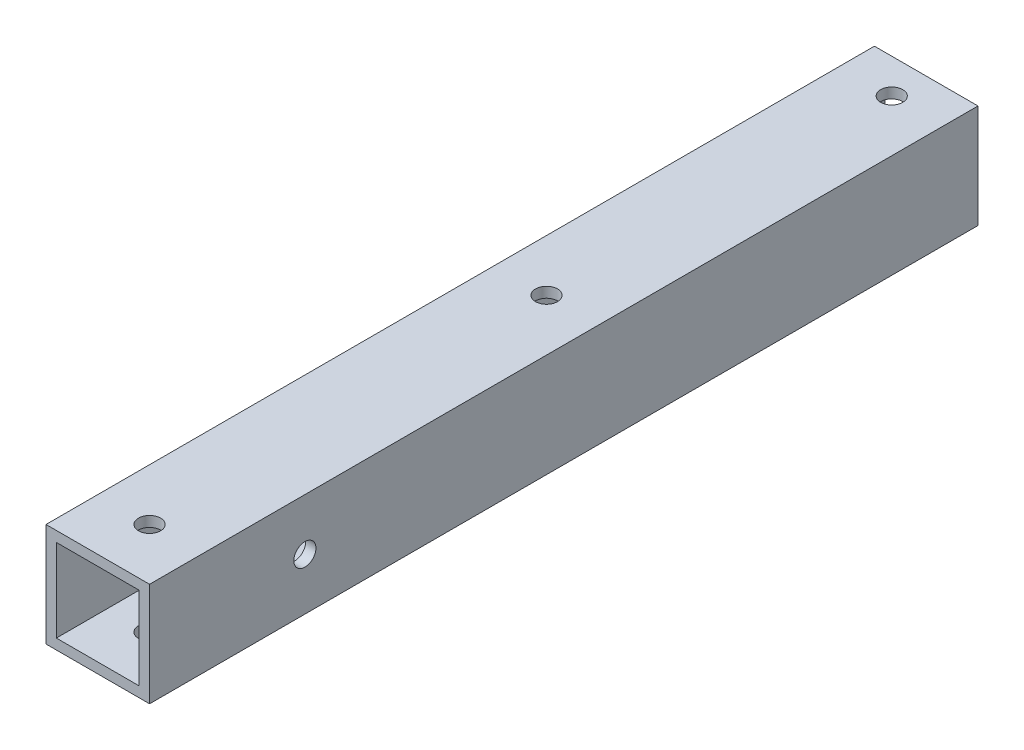
ISO-10303-21;
HEADER;
FILE_DESCRIPTION(('STEP AP214'),'2;1');
FILE_NAME('part.step','',(''),(''),'','','');
FILE_SCHEMA(('AUTOMOTIVE_DESIGN { 1 0 10303 214 1 1 1 1 }'));
ENDSEC;
DATA;
#1=APPLICATION_CONTEXT('core data for automotive mechanical design processes');
#2=APPLICATION_PROTOCOL_DEFINITION('international standard','automotive_design',2000,#1);
#3=PRODUCT_CONTEXT('',#1,'mechanical');
#4=PRODUCT('Part','Part','',(#3));
#5=PRODUCT_RELATED_PRODUCT_CATEGORY('part','',(#4));
#6=PRODUCT_DEFINITION_FORMATION('','',#4);
#7=PRODUCT_DEFINITION_CONTEXT('part definition',#1,'design');
#8=PRODUCT_DEFINITION('design','',#6,#7);
#9=PRODUCT_DEFINITION_SHAPE('','',#8);
#10=(LENGTH_UNIT() NAMED_UNIT(*) SI_UNIT(.MILLI.,.METRE.));
#11=(NAMED_UNIT(*) PLANE_ANGLE_UNIT() SI_UNIT($,.RADIAN.));
#12=(NAMED_UNIT(*) SI_UNIT($,.STERADIAN.) SOLID_ANGLE_UNIT());
#13=UNCERTAINTY_MEASURE_WITH_UNIT(LENGTH_MEASURE(1.E-05),#10,'distance_accuracy_value','');
#14=(GEOMETRIC_REPRESENTATION_CONTEXT(3) GLOBAL_UNCERTAINTY_ASSIGNED_CONTEXT((#13)) GLOBAL_UNIT_ASSIGNED_CONTEXT((#10,
#11,#12)) REPRESENTATION_CONTEXT('',''));
#15=CARTESIAN_POINT('',(0.,0.,0.));
#16=DIRECTION('',(0.,0.,1.));
#17=DIRECTION('',(1.,0.,0.));
#18=AXIS2_PLACEMENT_3D('',#15,#16,#17);
#19=CARTESIAN_POINT('',(0.,0.,120.));
#20=DIRECTION('',(0.,0.,1.));
#21=DIRECTION('',(1.,0.,0.));
#22=AXIS2_PLACEMENT_3D('',#19,#20,#21);
#23=PLANE('',#22);
#24=DIRECTION('',(0.,1.,0.));
#25=VECTOR('',#24,1.);
#26=CARTESIAN_POINT('',(7.5,7.5,120.));
#27=LINE('',#26,#25);
#28=CARTESIAN_POINT('',(7.5,-7.5,120.));
#29=VERTEX_POINT('',#28);
#30=CARTESIAN_POINT('',(7.5,7.5,120.));
#31=VERTEX_POINT('',#30);
#32=EDGE_CURVE('E157',#29,#31,#27,.T.);
#33=ORIENTED_EDGE('',*,*,#32,.T.);
#34=DIRECTION('',(-1.,0.,0.));
#35=VECTOR('',#34,1.);
#36=CARTESIAN_POINT('',(-7.5,7.5,120.));
#37=LINE('',#36,#35);
#38=CARTESIAN_POINT('',(-7.5,7.5,120.));
#39=VERTEX_POINT('',#38);
#40=EDGE_CURVE('E161',#31,#39,#37,.T.);
#41=ORIENTED_EDGE('',*,*,#40,.T.);
#42=DIRECTION('',(0.,-1.,0.));
#43=VECTOR('',#42,1.);
#44=CARTESIAN_POINT('',(-7.5,7.5,120.));
#45=LINE('',#44,#43);
#46=CARTESIAN_POINT('',(-7.5,-7.5,120.));
#47=VERTEX_POINT('',#46);
#48=EDGE_CURVE('E165',#39,#47,#45,.T.);
#49=ORIENTED_EDGE('',*,*,#48,.T.);
#50=DIRECTION('',(1.,0.,0.));
#51=VECTOR('',#50,1.);
#52=CARTESIAN_POINT('',(-7.5,-7.5,120.));
#53=LINE('',#52,#51);
#54=EDGE_CURVE('E168',#47,#29,#53,.T.);
#55=ORIENTED_EDGE('',*,*,#54,.T.);
#56=EDGE_LOOP('',(#33,#41,#49,#55));
#57=FACE_BOUND('',#56,.T.);
#58=DIRECTION('',(1.,0.,0.));
#59=VECTOR('',#58,1.);
#60=CARTESIAN_POINT('',(-6.,-6.,120.));
#61=LINE('',#60,#59);
#62=CARTESIAN_POINT('',(-6.,-6.,120.));
#63=VERTEX_POINT('',#62);
#64=CARTESIAN_POINT('',(6.,-6.,120.));
#65=VERTEX_POINT('',#64);
#66=EDGE_CURVE('E116',#63,#65,#61,.T.);
#67=ORIENTED_EDGE('',*,*,#66,.F.);
#68=DIRECTION('',(0.,-1.,0.));
#69=VECTOR('',#68,1.);
#70=CARTESIAN_POINT('',(-6.,6.,120.));
#71=LINE('',#70,#69);
#72=CARTESIAN_POINT('',(-6.,6.,120.));
#73=VERTEX_POINT('',#72);
#74=EDGE_CURVE('E107',#73,#63,#71,.T.);
#75=ORIENTED_EDGE('',*,*,#74,.F.);
#76=DIRECTION('',(-1.,0.,0.));
#77=VECTOR('',#76,1.);
#78=CARTESIAN_POINT('',(-6.,6.,120.));
#79=LINE('',#78,#77);
#80=CARTESIAN_POINT('',(6.,6.,120.));
#81=VERTEX_POINT('',#80);
#82=EDGE_CURVE('E133',#81,#73,#79,.T.);
#83=ORIENTED_EDGE('',*,*,#82,.F.);
#84=DIRECTION('',(0.,1.,0.));
#85=VECTOR('',#84,1.);
#86=CARTESIAN_POINT('',(6.,6.,120.));
#87=LINE('',#86,#85);
#88=EDGE_CURVE('E129',#65,#81,#87,.T.);
#89=ORIENTED_EDGE('',*,*,#88,.F.);
#90=EDGE_LOOP('',(#67,#75,#83,#89));
#91=FACE_BOUND('',#90,.T.);
#92=ADVANCED_FACE('F39',(#57,#91),#23,.T.);
#93=CARTESIAN_POINT('',(0.,0.,0.));
#94=DIRECTION('',(0.,0.,1.));
#95=DIRECTION('',(1.,0.,0.));
#96=AXIS2_PLACEMENT_3D('',#93,#94,#95);
#97=PLANE('',#96);
#98=DIRECTION('',(0.,1.,0.));
#99=VECTOR('',#98,1.);
#100=CARTESIAN_POINT('',(7.5,7.5,0.));
#101=LINE('',#100,#99);
#102=CARTESIAN_POINT('',(7.5,-7.5,0.));
#103=VERTEX_POINT('',#102);
#104=CARTESIAN_POINT('',(7.5,7.5,0.));
#105=VERTEX_POINT('',#104);
#106=EDGE_CURVE('E125',#103,#105,#101,.T.);
#107=ORIENTED_EDGE('',*,*,#106,.F.);
#108=DIRECTION('',(1.,0.,0.));
#109=VECTOR('',#108,1.);
#110=CARTESIAN_POINT('',(-7.5,-7.5,0.));
#111=LINE('',#110,#109);
#112=CARTESIAN_POINT('',(-7.5,-7.5,0.));
#113=VERTEX_POINT('',#112);
#114=EDGE_CURVE('E162',#113,#103,#111,.T.);
#115=ORIENTED_EDGE('',*,*,#114,.F.);
#116=DIRECTION('',(0.,-1.,0.));
#117=VECTOR('',#116,1.);
#118=CARTESIAN_POINT('',(-7.5,7.5,0.));
#119=LINE('',#118,#117);
#120=CARTESIAN_POINT('',(-7.5,7.5,0.));
#121=VERTEX_POINT('',#120);
#122=EDGE_CURVE('E178',#121,#113,#119,.T.);
#123=ORIENTED_EDGE('',*,*,#122,.F.);
#124=DIRECTION('',(-1.,0.,0.));
#125=VECTOR('',#124,1.);
#126=CARTESIAN_POINT('',(-7.5,7.5,0.));
#127=LINE('',#126,#125);
#128=EDGE_CURVE('E175',#105,#121,#127,.T.);
#129=ORIENTED_EDGE('',*,*,#128,.F.);
#130=EDGE_LOOP('',(#107,#115,#123,#129));
#131=FACE_BOUND('',#130,.T.);
#132=DIRECTION('',(0.,-1.,0.));
#133=VECTOR('',#132,1.);
#134=CARTESIAN_POINT('',(-6.,6.,0.));
#135=LINE('',#134,#133);
#136=CARTESIAN_POINT('',(-6.,6.,0.));
#137=VERTEX_POINT('',#136);
#138=CARTESIAN_POINT('',(-6.,-6.,0.));
#139=VERTEX_POINT('',#138);
#140=EDGE_CURVE('E65',#137,#139,#135,.T.);
#141=ORIENTED_EDGE('',*,*,#140,.T.);
#142=DIRECTION('',(1.,0.,0.));
#143=VECTOR('',#142,1.);
#144=CARTESIAN_POINT('',(-6.,-6.,0.));
#145=LINE('',#144,#143);
#146=CARTESIAN_POINT('',(6.,-6.,0.));
#147=VERTEX_POINT('',#146);
#148=EDGE_CURVE('E123',#139,#147,#145,.T.);
#149=ORIENTED_EDGE('',*,*,#148,.T.);
#150=DIRECTION('',(0.,1.,0.));
#151=VECTOR('',#150,1.);
#152=CARTESIAN_POINT('',(6.,6.,0.));
#153=LINE('',#152,#151);
#154=CARTESIAN_POINT('',(6.,6.,0.));
#155=VERTEX_POINT('',#154);
#156=EDGE_CURVE('E144',#147,#155,#153,.T.);
#157=ORIENTED_EDGE('',*,*,#156,.T.);
#158=DIRECTION('',(-1.,0.,0.));
#159=VECTOR('',#158,1.);
#160=CARTESIAN_POINT('',(-6.,6.,0.));
#161=LINE('',#160,#159);
#162=EDGE_CURVE('E117',#155,#137,#161,.T.);
#163=ORIENTED_EDGE('',*,*,#162,.T.);
#164=EDGE_LOOP('',(#141,#149,#157,#163));
#165=FACE_BOUND('',#164,.T.);
#166=ADVANCED_FACE('F269',(#131,#165),#97,.F.);
#167=CARTESIAN_POINT('',(7.5,7.5,120.));
#168=DIRECTION('',(-1.,0.,0.));
#169=DIRECTION('',(0.,0.,1.));
#170=AXIS2_PLACEMENT_3D('',#167,#168,#169);
#171=PLANE('',#170);
#172=CARTESIAN_POINT('',(7.5,0.,97.5));
#173=DIRECTION('',(1.,0.,0.));
#174=DIRECTION('',(0.,0.,-1.));
#175=AXIS2_PLACEMENT_3D('',#172,#173,#174);
#176=CIRCLE('',#175,1.60000000000001);
#177=CARTESIAN_POINT('',(7.5,0.,95.9));
#178=VERTEX_POINT('',#177);
#179=EDGE_CURVE('E246',#178,#178,#176,.T.);
#180=ORIENTED_EDGE('',*,*,#179,.F.);
#181=EDGE_LOOP('',(#180));
#182=FACE_BOUND('',#181,.T.);
#183=ORIENTED_EDGE('',*,*,#106,.T.);
#184=DIRECTION('',(0.,0.,-1.));
#185=VECTOR('',#184,1.);
#186=CARTESIAN_POINT('',(7.5,7.5,120.));
#187=LINE('',#186,#185);
#188=EDGE_CURVE('E11',#31,#105,#187,.T.);
#189=ORIENTED_EDGE('',*,*,#188,.F.);
#190=ORIENTED_EDGE('',*,*,#32,.F.);
#191=DIRECTION('',(0.,0.,-1.));
#192=VECTOR('',#191,1.);
#193=CARTESIAN_POINT('',(7.5,-7.5,120.));
#194=LINE('',#193,#192);
#195=EDGE_CURVE('E171',#29,#103,#194,.T.);
#196=ORIENTED_EDGE('',*,*,#195,.T.);
#197=EDGE_LOOP('',(#183,#189,#190,#196));
#198=FACE_BOUND('',#197,.T.);
#199=ADVANCED_FACE('F41',(#182,#198),#171,.F.);
#200=CARTESIAN_POINT('',(-7.5,7.5,120.));
#201=DIRECTION('',(0.,-1.,0.));
#202=DIRECTION('',(0.,0.,-1.));
#203=AXIS2_PLACEMENT_3D('',#200,#201,#202);
#204=PLANE('',#203);
#205=CARTESIAN_POINT('',(0.,7.5,5.));
#206=DIRECTION('',(0.,1.,0.));
#207=DIRECTION('',(0.,0.,1.));
#208=AXIS2_PLACEMENT_3D('',#205,#206,#207);
#209=CIRCLE('',#208,1.6);
#210=CARTESIAN_POINT('',(0.,7.5,6.6));
#211=VERTEX_POINT('',#210);
#212=EDGE_CURVE('E236',#211,#211,#209,.T.);
#213=ORIENTED_EDGE('',*,*,#212,.F.);
#214=EDGE_LOOP('',(#213));
#215=FACE_BOUND('',#214,.T.);
#216=CARTESIAN_POINT('',(0.,7.5,112.5));
#217=DIRECTION('',(0.,1.,0.));
#218=DIRECTION('',(0.,0.,1.));
#219=AXIS2_PLACEMENT_3D('',#216,#217,#218);
#220=CIRCLE('',#219,1.6);
#221=CARTESIAN_POINT('',(0.,7.5,114.1));
#222=VERTEX_POINT('',#221);
#223=EDGE_CURVE('E228',#222,#222,#220,.T.);
#224=ORIENTED_EDGE('',*,*,#223,.F.);
#225=EDGE_LOOP('',(#224));
#226=FACE_BOUND('',#225,.T.);
#227=CARTESIAN_POINT('',(0.,7.5,55.));
#228=DIRECTION('',(0.,1.,0.));
#229=DIRECTION('',(0.,0.,1.));
#230=AXIS2_PLACEMENT_3D('',#227,#228,#229);
#231=CIRCLE('',#230,1.6);
#232=CARTESIAN_POINT('',(0.,7.5,56.6));
#233=VERTEX_POINT('',#232);
#234=EDGE_CURVE('E219',#233,#233,#231,.T.);
#235=ORIENTED_EDGE('',*,*,#234,.F.);
#236=EDGE_LOOP('',(#235));
#237=FACE_BOUND('',#236,.T.);
#238=ORIENTED_EDGE('',*,*,#128,.T.);
#239=DIRECTION('',(0.,0.,-1.));
#240=VECTOR('',#239,1.);
#241=CARTESIAN_POINT('',(-7.5,7.5,120.));
#242=LINE('',#241,#240);
#243=EDGE_CURVE('E49',#39,#121,#242,.T.);
#244=ORIENTED_EDGE('',*,*,#243,.F.);
#245=ORIENTED_EDGE('',*,*,#40,.F.);
#246=ORIENTED_EDGE('',*,*,#188,.T.);
#247=EDGE_LOOP('',(#238,#244,#245,#246));
#248=FACE_BOUND('',#247,.T.);
#249=ADVANCED_FACE('F299',(#215,#226,#237,#248),#204,.F.);
#250=CARTESIAN_POINT('',(-7.5,7.5,120.));
#251=DIRECTION('',(1.,0.,0.));
#252=DIRECTION('',(0.,0.,-1.));
#253=AXIS2_PLACEMENT_3D('',#250,#251,#252);
#254=PLANE('',#253);
#255=CARTESIAN_POINT('',(-7.5,0.,97.5));
#256=DIRECTION('',(1.,0.,0.));
#257=DIRECTION('',(0.,0.,-1.));
#258=AXIS2_PLACEMENT_3D('',#255,#256,#257);
#259=CIRCLE('',#258,1.60000000000001);
#260=CARTESIAN_POINT('',(-7.5,0.,95.9));
#261=VERTEX_POINT('',#260);
#262=EDGE_CURVE('E250',#261,#261,#259,.T.);
#263=ORIENTED_EDGE('',*,*,#262,.T.);
#264=EDGE_LOOP('',(#263));
#265=FACE_BOUND('',#264,.T.);
#266=ORIENTED_EDGE('',*,*,#122,.T.);
#267=DIRECTION('',(0.,0.,-1.));
#268=VECTOR('',#267,1.);
#269=CARTESIAN_POINT('',(-7.5,-7.5,120.));
#270=LINE('',#269,#268);
#271=EDGE_CURVE('E186',#47,#113,#270,.T.);
#272=ORIENTED_EDGE('',*,*,#271,.F.);
#273=ORIENTED_EDGE('',*,*,#48,.F.);
#274=ORIENTED_EDGE('',*,*,#243,.T.);
#275=EDGE_LOOP('',(#266,#272,#273,#274));
#276=FACE_BOUND('',#275,.T.);
#277=ADVANCED_FACE('F296',(#265,#276),#254,.F.);
#278=CARTESIAN_POINT('',(-7.5,-7.5,120.));
#279=DIRECTION('',(0.,1.,0.));
#280=DIRECTION('',(0.,0.,1.));
#281=AXIS2_PLACEMENT_3D('',#278,#279,#280);
#282=PLANE('',#281);
#283=CARTESIAN_POINT('',(0.,-7.5,5.));
#284=DIRECTION('',(0.,1.,0.));
#285=DIRECTION('',(0.,0.,1.));
#286=AXIS2_PLACEMENT_3D('',#283,#284,#285);
#287=CIRCLE('',#286,1.6);
#288=CARTESIAN_POINT('',(0.,-7.5,6.6));
#289=VERTEX_POINT('',#288);
#290=EDGE_CURVE('E198',#289,#289,#287,.T.);
#291=ORIENTED_EDGE('',*,*,#290,.T.);
#292=EDGE_LOOP('',(#291));
#293=FACE_BOUND('',#292,.T.);
#294=CARTESIAN_POINT('',(0.,-7.5,112.5));
#295=DIRECTION('',(0.,1.,0.));
#296=DIRECTION('',(0.,0.,1.));
#297=AXIS2_PLACEMENT_3D('',#294,#295,#296);
#298=CIRCLE('',#297,1.6);
#299=CARTESIAN_POINT('',(0.,-7.5,114.1));
#300=VERTEX_POINT('',#299);
#301=EDGE_CURVE('E232',#300,#300,#298,.T.);
#302=ORIENTED_EDGE('',*,*,#301,.T.);
#303=EDGE_LOOP('',(#302));
#304=FACE_BOUND('',#303,.T.);
#305=CARTESIAN_POINT('',(0.,-7.5,55.));
#306=DIRECTION('',(0.,1.,0.));
#307=DIRECTION('',(0.,0.,1.));
#308=AXIS2_PLACEMENT_3D('',#305,#306,#307);
#309=CIRCLE('',#308,1.6);
#310=CARTESIAN_POINT('',(0.,-7.5,56.6));
#311=VERTEX_POINT('',#310);
#312=EDGE_CURVE('E223',#311,#311,#309,.T.);
#313=ORIENTED_EDGE('',*,*,#312,.T.);
#314=EDGE_LOOP('',(#313));
#315=FACE_BOUND('',#314,.T.);
#316=ORIENTED_EDGE('',*,*,#114,.T.);
#317=ORIENTED_EDGE('',*,*,#195,.F.);
#318=ORIENTED_EDGE('',*,*,#54,.F.);
#319=ORIENTED_EDGE('',*,*,#271,.T.);
#320=EDGE_LOOP('',(#316,#317,#318,#319));
#321=FACE_BOUND('',#320,.T.);
#322=ADVANCED_FACE('F293',(#293,#304,#315,#321),#282,.F.);
#323=CARTESIAN_POINT('',(-6.,6.,120.));
#324=DIRECTION('',(1.,0.,0.));
#325=DIRECTION('',(0.,0.,-1.));
#326=AXIS2_PLACEMENT_3D('',#323,#324,#325);
#327=PLANE('',#326);
#328=CARTESIAN_POINT('',(-6.,0.,97.5));
#329=DIRECTION('',(1.,0.,0.));
#330=DIRECTION('',(0.,0.,-1.));
#331=AXIS2_PLACEMENT_3D('',#328,#329,#330);
#332=CIRCLE('',#331,1.60000000000001);
#333=CARTESIAN_POINT('',(-6.,0.,95.9));
#334=VERTEX_POINT('',#333);
#335=EDGE_CURVE('E224',#334,#334,#332,.T.);
#336=ORIENTED_EDGE('',*,*,#335,.F.);
#337=EDGE_LOOP('',(#336));
#338=FACE_BOUND('',#337,.T.);
#339=ORIENTED_EDGE('',*,*,#140,.F.);
#340=DIRECTION('',(0.,0.,-1.));
#341=VECTOR('',#340,1.);
#342=CARTESIAN_POINT('',(-6.,6.,120.));
#343=LINE('',#342,#341);
#344=EDGE_CURVE('E111',#73,#137,#343,.T.);
#345=ORIENTED_EDGE('',*,*,#344,.F.);
#346=ORIENTED_EDGE('',*,*,#74,.T.);
#347=DIRECTION('',(0.,0.,-1.));
#348=VECTOR('',#347,1.);
#349=CARTESIAN_POINT('',(-6.,-6.,120.));
#350=LINE('',#349,#348);
#351=EDGE_CURVE('E110',#63,#139,#350,.T.);
#352=ORIENTED_EDGE('',*,*,#351,.T.);
#353=EDGE_LOOP('',(#339,#345,#346,#352));
#354=FACE_BOUND('',#353,.T.);
#355=ADVANCED_FACE('F109',(#338,#354),#327,.T.);
#356=CARTESIAN_POINT('',(-6.,-6.,120.));
#357=DIRECTION('',(0.,1.,0.));
#358=DIRECTION('',(0.,0.,1.));
#359=AXIS2_PLACEMENT_3D('',#356,#357,#358);
#360=PLANE('',#359);
#361=CARTESIAN_POINT('',(0.,-6.,5.));
#362=DIRECTION('',(0.,1.,0.));
#363=DIRECTION('',(0.,0.,1.));
#364=AXIS2_PLACEMENT_3D('',#361,#362,#363);
#365=CIRCLE('',#364,1.6);
#366=CARTESIAN_POINT('',(0.,-6.,6.6));
#367=VERTEX_POINT('',#366);
#368=EDGE_CURVE('E141',#367,#367,#365,.T.);
#369=ORIENTED_EDGE('',*,*,#368,.F.);
#370=EDGE_LOOP('',(#369));
#371=FACE_BOUND('',#370,.T.);
#372=CARTESIAN_POINT('',(0.,-6.,112.5));
#373=DIRECTION('',(0.,1.,0.));
#374=DIRECTION('',(0.,0.,1.));
#375=AXIS2_PLACEMENT_3D('',#372,#373,#374);
#376=CIRCLE('',#375,1.6);
#377=CARTESIAN_POINT('',(0.,-6.,114.1));
#378=VERTEX_POINT('',#377);
#379=EDGE_CURVE('E202',#378,#378,#376,.T.);
#380=ORIENTED_EDGE('',*,*,#379,.F.);
#381=EDGE_LOOP('',(#380));
#382=FACE_BOUND('',#381,.T.);
#383=CARTESIAN_POINT('',(0.,-6.,55.));
#384=DIRECTION('',(0.,1.,0.));
#385=DIRECTION('',(0.,0.,1.));
#386=AXIS2_PLACEMENT_3D('',#383,#384,#385);
#387=CIRCLE('',#386,1.6);
#388=CARTESIAN_POINT('',(0.,-6.,56.6));
#389=VERTEX_POINT('',#388);
#390=EDGE_CURVE('E197',#389,#389,#387,.T.);
#391=ORIENTED_EDGE('',*,*,#390,.F.);
#392=EDGE_LOOP('',(#391));
#393=FACE_BOUND('',#392,.T.);
#394=ORIENTED_EDGE('',*,*,#148,.F.);
#395=ORIENTED_EDGE('',*,*,#351,.F.);
#396=ORIENTED_EDGE('',*,*,#66,.T.);
#397=DIRECTION('',(0.,0.,-1.));
#398=VECTOR('',#397,1.);
#399=CARTESIAN_POINT('',(6.,-6.,120.));
#400=LINE('',#399,#398);
#401=EDGE_CURVE('E126',#65,#147,#400,.T.);
#402=ORIENTED_EDGE('',*,*,#401,.T.);
#403=EDGE_LOOP('',(#394,#395,#396,#402));
#404=FACE_BOUND('',#403,.T.);
#405=ADVANCED_FACE('F120',(#371,#382,#393,#404),#360,.T.);
#406=CARTESIAN_POINT('',(6.,6.,120.));
#407=DIRECTION('',(-1.,0.,0.));
#408=DIRECTION('',(0.,0.,1.));
#409=AXIS2_PLACEMENT_3D('',#406,#407,#408);
#410=PLANE('',#409);
#411=CARTESIAN_POINT('',(6.,0.,97.5));
#412=DIRECTION('',(-1.,0.,0.));
#413=DIRECTION('',(0.,0.,1.));
#414=AXIS2_PLACEMENT_3D('',#411,#412,#413);
#415=CIRCLE('',#414,1.60000000000001);
#416=CARTESIAN_POINT('',(6.,0.,99.1));
#417=VERTEX_POINT('',#416);
#418=EDGE_CURVE('E43',#417,#417,#415,.T.);
#419=ORIENTED_EDGE('',*,*,#418,.F.);
#420=EDGE_LOOP('',(#419));
#421=FACE_BOUND('',#420,.T.);
#422=ORIENTED_EDGE('',*,*,#156,.F.);
#423=ORIENTED_EDGE('',*,*,#401,.F.);
#424=ORIENTED_EDGE('',*,*,#88,.T.);
#425=DIRECTION('',(0.,0.,-1.));
#426=VECTOR('',#425,1.);
#427=CARTESIAN_POINT('',(6.,6.,120.));
#428=LINE('',#427,#426);
#429=EDGE_CURVE('E57',#81,#155,#428,.T.);
#430=ORIENTED_EDGE('',*,*,#429,.T.);
#431=EDGE_LOOP('',(#422,#423,#424,#430));
#432=FACE_BOUND('',#431,.T.);
#433=ADVANCED_FACE('F262',(#421,#432),#410,.T.);
#434=CARTESIAN_POINT('',(-6.,6.,120.));
#435=DIRECTION('',(0.,-1.,0.));
#436=DIRECTION('',(0.,0.,-1.));
#437=AXIS2_PLACEMENT_3D('',#434,#435,#436);
#438=PLANE('',#437);
#439=CARTESIAN_POINT('',(0.,6.,5.));
#440=DIRECTION('',(0.,-1.,0.));
#441=DIRECTION('',(0.,0.,-1.));
#442=AXIS2_PLACEMENT_3D('',#439,#440,#441);
#443=CIRCLE('',#442,1.6);
#444=CARTESIAN_POINT('',(0.,6.,3.4));
#445=VERTEX_POINT('',#444);
#446=EDGE_CURVE('E203',#445,#445,#443,.T.);
#447=ORIENTED_EDGE('',*,*,#446,.F.);
#448=EDGE_LOOP('',(#447));
#449=FACE_BOUND('',#448,.T.);
#450=CARTESIAN_POINT('',(0.,6.,112.5));
#451=DIRECTION('',(0.,-1.,0.));
#452=DIRECTION('',(0.,0.,-1.));
#453=AXIS2_PLACEMENT_3D('',#450,#451,#452);
#454=CIRCLE('',#453,1.6);
#455=CARTESIAN_POINT('',(0.,6.,110.9));
#456=VERTEX_POINT('',#455);
#457=EDGE_CURVE('E199',#456,#456,#454,.T.);
#458=ORIENTED_EDGE('',*,*,#457,.F.);
#459=EDGE_LOOP('',(#458));
#460=FACE_BOUND('',#459,.T.);
#461=CARTESIAN_POINT('',(0.,6.,55.));
#462=DIRECTION('',(0.,-1.,0.));
#463=DIRECTION('',(0.,0.,-1.));
#464=AXIS2_PLACEMENT_3D('',#461,#462,#463);
#465=CIRCLE('',#464,1.6);
#466=CARTESIAN_POINT('',(0.,6.,53.4));
#467=VERTEX_POINT('',#466);
#468=EDGE_CURVE('E193',#467,#467,#465,.T.);
#469=ORIENTED_EDGE('',*,*,#468,.F.);
#470=EDGE_LOOP('',(#469));
#471=FACE_BOUND('',#470,.T.);
#472=ORIENTED_EDGE('',*,*,#162,.F.);
#473=ORIENTED_EDGE('',*,*,#429,.F.);
#474=ORIENTED_EDGE('',*,*,#82,.T.);
#475=ORIENTED_EDGE('',*,*,#344,.T.);
#476=EDGE_LOOP('',(#472,#473,#474,#475));
#477=FACE_BOUND('',#476,.T.);
#478=ADVANCED_FACE('F265',(#449,#460,#471,#477),#438,.T.);
#479=CARTESIAN_POINT('',(0.,-7.5,55.));
#480=DIRECTION('',(0.,1.,0.));
#481=DIRECTION('',(0.,0.,1.));
#482=AXIS2_PLACEMENT_3D('',#479,#480,#481);
#483=CYLINDRICAL_SURFACE('',#482,1.6);
#484=ORIENTED_EDGE('',*,*,#468,.T.);
#485=EDGE_LOOP('',(#484));
#486=FACE_BOUND('',#485,.T.);
#487=ORIENTED_EDGE('',*,*,#234,.T.);
#488=EDGE_LOOP('',(#487));
#489=FACE_BOUND('',#488,.T.);
#490=ADVANCED_FACE('F271',(#486,#489),#483,.F.);
#491=CARTESIAN_POINT('',(0.,-7.5,112.5));
#492=DIRECTION('',(0.,1.,0.));
#493=DIRECTION('',(0.,0.,1.));
#494=AXIS2_PLACEMENT_3D('',#491,#492,#493);
#495=CYLINDRICAL_SURFACE('',#494,1.6);
#496=ORIENTED_EDGE('',*,*,#457,.T.);
#497=EDGE_LOOP('',(#496));
#498=FACE_BOUND('',#497,.T.);
#499=ORIENTED_EDGE('',*,*,#223,.T.);
#500=EDGE_LOOP('',(#499));
#501=FACE_BOUND('',#500,.T.);
#502=ADVANCED_FACE('F277',(#498,#501),#495,.F.);
#503=CARTESIAN_POINT('',(0.,-7.5,5.));
#504=DIRECTION('',(0.,1.,0.));
#505=DIRECTION('',(0.,0.,1.));
#506=AXIS2_PLACEMENT_3D('',#503,#504,#505);
#507=CYLINDRICAL_SURFACE('',#506,1.6);
#508=ORIENTED_EDGE('',*,*,#446,.T.);
#509=EDGE_LOOP('',(#508));
#510=FACE_BOUND('',#509,.T.);
#511=ORIENTED_EDGE('',*,*,#212,.T.);
#512=EDGE_LOOP('',(#511));
#513=FACE_BOUND('',#512,.T.);
#514=ADVANCED_FACE('F328',(#510,#513),#507,.F.);
#515=ORIENTED_EDGE('',*,*,#390,.T.);
#516=EDGE_LOOP('',(#515));
#517=FACE_BOUND('',#516,.T.);
#518=ORIENTED_EDGE('',*,*,#312,.F.);
#519=EDGE_LOOP('',(#518));
#520=FACE_BOUND('',#519,.T.);
#521=ADVANCED_FACE('F280',(#517,#520),#483,.F.);
#522=ORIENTED_EDGE('',*,*,#379,.T.);
#523=EDGE_LOOP('',(#522));
#524=FACE_BOUND('',#523,.T.);
#525=ORIENTED_EDGE('',*,*,#301,.F.);
#526=EDGE_LOOP('',(#525));
#527=FACE_BOUND('',#526,.T.);
#528=ADVANCED_FACE('F331',(#524,#527),#495,.F.);
#529=ORIENTED_EDGE('',*,*,#368,.T.);
#530=EDGE_LOOP('',(#529));
#531=FACE_BOUND('',#530,.T.);
#532=ORIENTED_EDGE('',*,*,#290,.F.);
#533=EDGE_LOOP('',(#532));
#534=FACE_BOUND('',#533,.T.);
#535=ADVANCED_FACE('F336',(#531,#534),#507,.F.);
#536=CARTESIAN_POINT('',(-7.5,0.,97.5));
#537=DIRECTION('',(1.,0.,0.));
#538=DIRECTION('',(0.,0.,-1.));
#539=AXIS2_PLACEMENT_3D('',#536,#537,#538);
#540=CYLINDRICAL_SURFACE('',#539,1.60000000000001);
#541=ORIENTED_EDGE('',*,*,#418,.T.);
#542=EDGE_LOOP('',(#541));
#543=FACE_BOUND('',#542,.T.);
#544=ORIENTED_EDGE('',*,*,#179,.T.);
#545=EDGE_LOOP('',(#544));
#546=FACE_BOUND('',#545,.T.);
#547=ADVANCED_FACE('F259',(#543,#546),#540,.F.);
#548=ORIENTED_EDGE('',*,*,#335,.T.);
#549=EDGE_LOOP('',(#548));
#550=FACE_BOUND('',#549,.T.);
#551=ORIENTED_EDGE('',*,*,#262,.F.);
#552=EDGE_LOOP('',(#551));
#553=FACE_BOUND('',#552,.T.);
#554=ADVANCED_FACE('F368',(#550,#553),#540,.F.);
#555=CLOSED_SHELL('',(#92,#166,#199,#249,#277,#322,#355,#405,#433,#478,#490,#502,#514,#521,#528,
#535,#547,#554));
#556=MANIFOLD_SOLID_BREP('B2',#555);
#557=ADVANCED_BREP_SHAPE_REPRESENTATION('',(#18,#556),#14);
#558=SHAPE_DEFINITION_REPRESENTATION(#9,#557);
ENDSEC;
END-ISO-10303-21;
